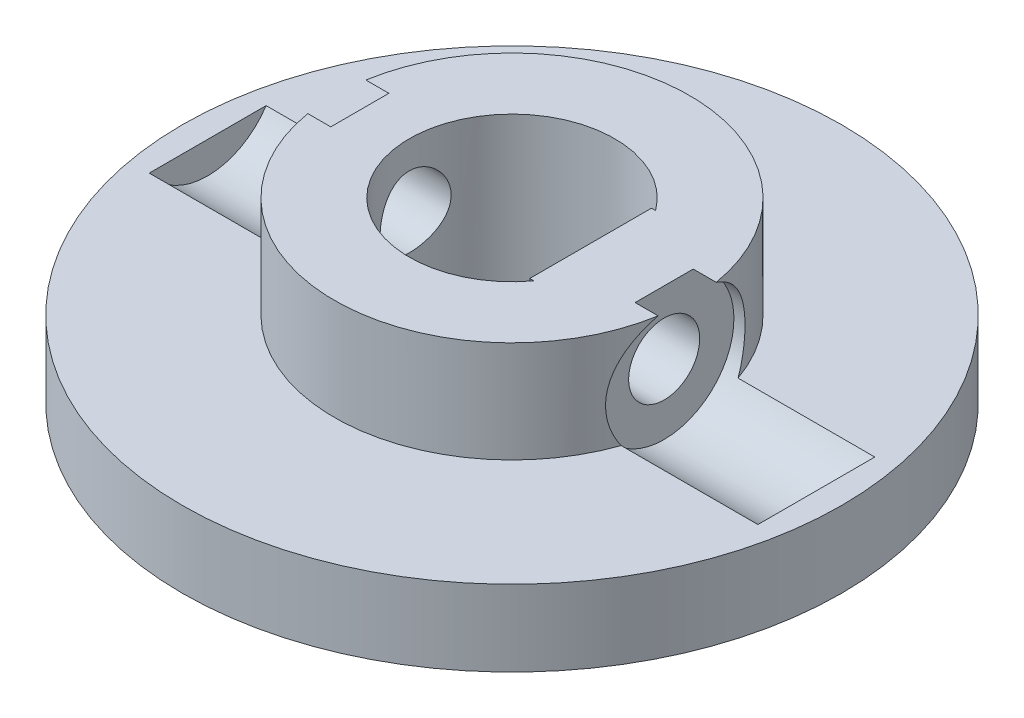
ISO-10303-21;
HEADER;
FILE_DESCRIPTION(('STEP AP214'),'2;1');
FILE_NAME('part.step','',(''),(''),'','','');
FILE_SCHEMA(('AUTOMOTIVE_DESIGN { 1 0 10303 214 1 1 1 1 }'));
ENDSEC;
DATA;
#1=APPLICATION_CONTEXT('core data for automotive mechanical design processes');
#2=APPLICATION_PROTOCOL_DEFINITION('international standard','automotive_design',2000,#1);
#3=PRODUCT_CONTEXT('',#1,'mechanical');
#4=PRODUCT('Part','Part','',(#3));
#5=PRODUCT_RELATED_PRODUCT_CATEGORY('part','',(#4));
#6=PRODUCT_DEFINITION_FORMATION('','',#4);
#7=PRODUCT_DEFINITION_CONTEXT('part definition',#1,'design');
#8=PRODUCT_DEFINITION('design','',#6,#7);
#9=PRODUCT_DEFINITION_SHAPE('','',#8);
#10=(LENGTH_UNIT() NAMED_UNIT(*) SI_UNIT(.MILLI.,.METRE.));
#11=(NAMED_UNIT(*) PLANE_ANGLE_UNIT() SI_UNIT($,.RADIAN.));
#12=(NAMED_UNIT(*) SI_UNIT($,.STERADIAN.) SOLID_ANGLE_UNIT());
#13=UNCERTAINTY_MEASURE_WITH_UNIT(LENGTH_MEASURE(1.E-05),#10,'distance_accuracy_value','');
#14=(GEOMETRIC_REPRESENTATION_CONTEXT(3) GLOBAL_UNCERTAINTY_ASSIGNED_CONTEXT((#13)) GLOBAL_UNIT_ASSIGNED_CONTEXT((#10,
#11,#12)) REPRESENTATION_CONTEXT('',''));
#15=CARTESIAN_POINT('',(0.,0.,0.));
#16=DIRECTION('',(0.,0.,1.));
#17=DIRECTION('',(1.,0.,0.));
#18=AXIS2_PLACEMENT_3D('',#15,#16,#17);
#19=CARTESIAN_POINT('',(0.,44.,0.));
#20=DIRECTION('',(0.,-1.,0.));
#21=DIRECTION('',(0.,0.,-1.));
#22=AXIS2_PLACEMENT_3D('',#19,#20,#21);
#23=CYLINDRICAL_SURFACE('',#22,4.05);
#24=CARTESIAN_POINT('',(0.,41.,0.));
#25=DIRECTION('',(0.,1.,0.));
#26=DIRECTION('',(0.,0.,1.));
#27=AXIS2_PLACEMENT_3D('',#24,#25,#26);
#28=CIRCLE('',#27,4.05);
#29=CARTESIAN_POINT('',(0.,41.,4.05));
#30=VERTEX_POINT('',#29);
#31=EDGE_CURVE('E178',#30,#30,#28,.T.);
#32=ORIENTED_EDGE('',*,*,#31,.F.);
#33=EDGE_LOOP('',(#32));
#34=FACE_BOUND('',#33,.T.);
#35=CARTESIAN_POINT('',(0.,48.,0.));
#36=DIRECTION('',(0.,1.,0.));
#37=DIRECTION('',(0.,0.,1.));
#38=AXIS2_PLACEMENT_3D('',#35,#36,#37);
#39=CIRCLE('',#38,4.05);
#40=CARTESIAN_POINT('',(3.26228447563973,48.,-2.4));
#41=VERTEX_POINT('',#40);
#42=CARTESIAN_POINT('',(3.26228447563973,48.,2.4));
#43=VERTEX_POINT('',#42);
#44=EDGE_CURVE('E193',#41,#43,#39,.T.);
#45=ORIENTED_EDGE('',*,*,#44,.T.);
#46=DIRECTION('',(0.,-1.,0.));
#47=VECTOR('',#46,1.);
#48=CARTESIAN_POINT('',(3.26228447563973,44.,2.4));
#49=LINE('',#48,#47);
#50=CARTESIAN_POINT('',(3.26228447563973,44.,2.4));
#51=VERTEX_POINT('',#50);
#52=EDGE_CURVE('E196',#43,#51,#49,.T.);
#53=ORIENTED_EDGE('',*,*,#52,.T.);
#54=CARTESIAN_POINT('',(0.,44.,0.));
#55=DIRECTION('',(0.,-1.,0.));
#56=DIRECTION('',(0.,0.,-1.));
#57=AXIS2_PLACEMENT_3D('',#54,#55,#56);
#58=CIRCLE('',#57,4.05);
#59=CARTESIAN_POINT('',(3.26228447563973,44.,-2.4));
#60=VERTEX_POINT('',#59);
#61=EDGE_CURVE('E166',#60,#51,#58,.T.);
#62=ORIENTED_EDGE('',*,*,#61,.F.);
#63=DIRECTION('',(0.,-1.,0.));
#64=VECTOR('',#63,1.);
#65=CARTESIAN_POINT('',(3.26228447563973,44.,-2.4));
#66=LINE('',#65,#64);
#67=EDGE_CURVE('E197',#60,#41,#66,.F.);
#68=ORIENTED_EDGE('',*,*,#67,.T.);
#69=EDGE_LOOP('',(#45,#53,#62,#68));
#70=FACE_BOUND('',#69,.T.);
#71=CARTESIAN_POINT('',(-3.80032893313197,45.5,1.4));
#72=CARTESIAN_POINT('',(-3.80032812113727,45.5760720109124,1.40000098422699));
#73=CARTESIAN_POINT('',(-3.80263798720384,45.6521371854911,1.39377881376786));
#74=CARTESIAN_POINT('',(-3.81157522511216,45.8020024885736,1.36914665694002));
#75=CARTESIAN_POINT('',(-3.81820304552078,45.8758023809165,1.35073540431613));
#76=CARTESIAN_POINT('',(-3.83493767525478,46.018939410854,1.30245835758085));
#77=CARTESIAN_POINT('',(-3.84503724069611,46.0882854866961,1.27261639922499));
#78=CARTESIAN_POINT('',(-3.86756654231983,46.2210109336976,1.20240741585234));
#79=CARTESIAN_POINT('',(-3.87999685084287,46.2843888335485,1.16203780469628));
#80=CARTESIAN_POINT('',(-3.90637404148735,46.4060480971093,1.07009820004064));
#81=CARTESIAN_POINT('',(-3.92036074894465,46.4640417447618,1.01815881625623));
#82=CARTESIAN_POINT('',(-3.94793946307876,46.5706936749783,0.905341059514607));
#83=CARTESIAN_POINT('',(-3.96153140048799,46.619350327542,0.844461129035619));
#84=CARTESIAN_POINT('',(-3.98725371248317,46.7072752086933,0.713363730382172));
#85=CARTESIAN_POINT('',(-3.99933183709569,46.7462387648325,0.642930762475667));
#86=CARTESIAN_POINT('',(-4.02019373787452,46.8116491222764,0.496020316335563));
#87=CARTESIAN_POINT('',(-4.02897847330284,46.8380995688502,0.419544606035188));
#88=CARTESIAN_POINT('',(-4.0419815428216,46.8767477547424,0.265738581644376));
#89=CARTESIAN_POINT('',(-4.04635758356729,46.8894390702158,0.188545877578348));
#90=CARTESIAN_POINT('',(-4.05061176756717,46.9017815716772,0.0330107300172756));
#91=CARTESIAN_POINT('',(-4.05049115574787,46.9014363669073,-0.0453313892508603));
#92=CARTESIAN_POINT('',(-4.04587064154934,46.888021421929,-0.197435441900466));
#93=CARTESIAN_POINT('',(-4.04155549413247,46.8754884993241,-0.27125126713992));
#94=CARTESIAN_POINT('',(-4.0292656767644,46.8389459485529,-0.415658936889611));
#95=CARTESIAN_POINT('',(-4.0212907544945,46.8149355290797,-0.486250558742079));
#96=CARTESIAN_POINT('',(-4.00234991178046,46.7558249823521,-0.623340113362765));
#97=CARTESIAN_POINT('',(-3.99134472604314,46.7205782399222,-0.6897691792348));
#98=CARTESIAN_POINT('',(-3.96747993983604,46.6401187038445,-0.815923333139488));
#99=CARTESIAN_POINT('',(-3.95461979781574,46.5949029977346,-0.875646454298757));
#100=CARTESIAN_POINT('',(-3.92762744149222,46.4931168725459,-0.98987949259288));
#101=CARTESIAN_POINT('',(-3.91346378134078,46.4360890940775,-1.04397506209571));
#102=CARTESIAN_POINT('',(-3.88599906105279,46.313659638694,-1.14197538851592));
#103=CARTESIAN_POINT('',(-3.87269815587486,46.2482564637213,-1.18587831837483));
#104=CARTESIAN_POINT('',(-3.84828505094871,46.1095294501499,-1.26288033946573));
#105=CARTESIAN_POINT('',(-3.83721218685493,46.0360936041449,-1.29579107646938));
#106=CARTESIAN_POINT('',(-3.81896289837998,45.8842416205629,-1.34863382894297));
#107=CARTESIAN_POINT('',(-3.81178469219259,45.8058277787914,-1.36857178029633));
#108=CARTESIAN_POINT('',(-3.80254545820197,45.6502843860542,-1.39403146355698));
#109=CARTESIAN_POINT('',(-3.80025495155443,45.573274409251,-1.40020034618308));
#110=CARTESIAN_POINT('',(-3.80040653990353,45.4193020253982,-1.39978981303751));
#111=CARTESIAN_POINT('',(-3.80284768993273,45.3423396119202,-1.3932129427425));
#112=CARTESIAN_POINT('',(-3.81195747997688,45.193693673689,-1.36808078294112));
#113=CARTESIAN_POINT('',(-3.81846234457071,45.1219206345597,-1.34998905566805));
#114=CARTESIAN_POINT('',(-3.83478240945058,44.9824481574394,-1.30290459847902));
#115=CARTESIAN_POINT('',(-3.84459822383498,44.9147494778871,-1.27390984620999));
#116=CARTESIAN_POINT('',(-3.86684046898231,44.7828328835213,-1.20474187839379));
#117=CARTESIAN_POINT('',(-3.87934330860911,44.7188074219997,-1.16422687022564));
#118=CARTESIAN_POINT('',(-3.90540844751767,44.5982309299537,-1.07354883196725));
#119=CARTESIAN_POINT('',(-3.91897108066806,44.541682270086,-1.02338275414744));
#120=CARTESIAN_POINT('',(-3.94648649728668,44.4346007802007,-0.911710279289806));
#121=CARTESIAN_POINT('',(-3.96042252246501,44.3845380135079,-0.84974761531962));
#122=CARTESIAN_POINT('',(-3.98641977085735,44.2954830136483,-0.717956937741279));
#123=CARTESIAN_POINT('',(-3.99848104430982,44.256490483805,-0.648129134984759));
#124=CARTESIAN_POINT('',(-4.019324464162,44.1910195232052,-0.502868298688732));
#125=CARTESIAN_POINT('',(-4.02812570094353,44.1644679887241,-0.427471101847702));
#126=CARTESIAN_POINT('',(-4.04153726330383,44.1245431969524,-0.272914258615079));
#127=CARTESIAN_POINT('',(-4.04614922934161,44.1111647810829,-0.193756097752663));
#128=CARTESIAN_POINT('',(-4.0505296031405,44.0984573883936,-0.0382083464369651));
#129=CARTESIAN_POINT('',(-4.05052988190709,44.0984558381744,0.0381203340772005));
#130=CARTESIAN_POINT('',(-4.04626733993027,44.1108228838361,0.189639953947756));
#131=CARTESIAN_POINT('',(-4.04200491005722,44.1231903455367,0.264830996978448));
#132=CARTESIAN_POINT('',(-4.02978738559328,44.1594890816326,0.410573093003151));
#133=CARTESIAN_POINT('',(-4.02190072905705,44.1832063610843,0.481183598177917));
#134=CARTESIAN_POINT('',(-4.00324819123401,44.2413295659086,0.617445005907795));
#135=CARTESIAN_POINT('',(-3.99248177784391,44.2757374668169,0.683094989010976));
#136=CARTESIAN_POINT('',(-3.96865262150081,44.3557898576263,0.810339080391839));
#137=CARTESIAN_POINT('',(-3.95551726283513,44.4018169242524,0.871678698228788));
#138=CARTESIAN_POINT('',(-3.928587176257,44.5031645067486,0.985980365684454));
#139=CARTESIAN_POINT('',(-3.91479223118132,44.5584880987065,1.03893963106469));
#140=CARTESIAN_POINT('',(-3.88738614533976,44.6796966341466,1.13729968324724));
#141=CARTESIAN_POINT('',(-3.87380837984383,44.7459332733859,1.18227784474417));
#142=CARTESIAN_POINT('',(-3.84908641549547,44.8854528212596,1.2604452216498));
#143=CARTESIAN_POINT('',(-3.83794181460534,44.9587345629279,1.29363638522155));
#144=CARTESIAN_POINT('',(-3.81969760982419,45.1088255159717,1.34654514346996));
#145=CARTESIAN_POINT('',(-3.81252115077366,45.1855341227965,1.36652032703137));
#146=CARTESIAN_POINT('',(-3.80283821522738,45.3414983480825,1.39324446748198));
#147=CARTESIAN_POINT('',(-3.80032977901784,45.4207528834988,1.39999897469319));
#148=CARTESIAN_POINT('',(-3.80032893313197,45.5,1.4));
#149=B_SPLINE_CURVE_WITH_KNOTS('',3,(#71,#72,#73,#74,#75,#76,#77,#78,#79,#80,#81,#82,#83,#84,
#85,#86,#87,#88,#89,#90,#91,#92,#93,#94,#95,#96,#97,#98,#99,#100,#101,#102,#103,#104,#105,#106,
#107,#108,#109,#110,#111,#112,#113,#114,#115,#116,#117,#118,#119,#120,#121,#122,#123,#124,#125,
#126,#127,#128,#129,#130,#131,#132,#133,#134,#135,#136,#137,#138,#139,#140,#141,#142,#143,#144,
#145,#146,#147,#148),.UNSPECIFIED.,.T.,.F.,(4,2,2,2,2,2,2,2,2,2,2,2,2,2,2,2,2,2,2,2,2,2,2,2,2,2,
2,2,2,2,2,2,2,2,2,2,2,2,4),(0.,0.227922099188714,0.455867879638449,0.683340903684274,
0.910869859663723,1.14710288999006,1.38337712311254,1.62633813931509,1.86922833343483,
2.1030834348325,2.33687379245654,2.56081235872791,2.78476636648917,3.01177121572749,
3.23884247319105,3.47735601694402,3.71591228194712,3.95836845901259,4.20071361862837,
4.43140470605175,4.66204972650137,4.88395084092895,5.10589313511526,5.33526697493179,
5.56471336840146,5.80617438972034,6.04762893940022,6.28764632819606,6.52756968901762,
6.75542990555556,6.98326923029712,7.2069725577209,7.43071724822078,7.66310137283703,
7.89556254200708,8.13801357321436,8.38042451327956,8.61795940461311,8.8553945523235),.UNSPECIFIED.);
#150=CARTESIAN_POINT('',(-3.80032893313197,45.5,1.4));
#151=VERTEX_POINT('',#150);
#152=EDGE_CURVE('E330',#151,#151,#149,.T.);
#153=ORIENTED_EDGE('',*,*,#152,.T.);
#154=EDGE_LOOP('',(#153));
#155=FACE_BOUND('',#154,.T.);
#156=ADVANCED_FACE('F42',(#34,#70,#155),#23,.F.);
#157=CARTESIAN_POINT('',(0.,48.,0.));
#158=DIRECTION('',(0.,-1.,0.));
#159=DIRECTION('',(0.,0.,-1.));
#160=AXIS2_PLACEMENT_3D('',#157,#158,#159);
#161=CYLINDRICAL_SURFACE('',#160,7.);
#162=CARTESIAN_POINT('',(6.90561365846661,48.0000000000001,1.14564392373868));
#163=CARTESIAN_POINT('',(6.89374771517784,47.9672099399644,1.21719398865301));
#164=CARTESIAN_POINT('',(6.8809909750092,47.9314261332552,1.28717055550123));
#165=CARTESIAN_POINT('',(6.85406593743405,47.8541551666594,1.42358793963985));
#166=CARTESIAN_POINT('',(6.83989807481792,47.8126697620428,1.49002983640068));
#167=CARTESIAN_POINT('',(6.79585965600312,47.6801715267832,1.68336390921621));
#168=CARTESIAN_POINT('',(6.76442078484839,47.5810280607942,1.80445655817006));
#169=CARTESIAN_POINT('',(6.700825905405,47.3639520973799,2.02792279637564));
#170=CARTESIAN_POINT('',(6.66867031370821,47.2460302818912,2.13030695714263));
#171=CARTESIAN_POINT('',(6.60717780123408,46.9940535394791,2.3139991563166));
#172=CARTESIAN_POINT('',(6.57784103462369,46.8599977310589,2.3953060423795));
#173=CARTESIAN_POINT('',(6.52541302668286,46.5782940984035,2.53467706584074));
#174=CARTESIAN_POINT('',(6.50235228152522,46.4305844196177,2.59262834725676));
#175=CARTESIAN_POINT('',(6.4658390536539,46.1263313237695,2.68240847070945));
#176=CARTESIAN_POINT('',(6.4523794062531,45.9697945881061,2.71425679436916));
#177=CARTESIAN_POINT('',(6.4376000666213,45.6639940638352,2.74911503811838));
#178=CARTESIAN_POINT('',(6.43550473897019,45.5149765908663,2.75396807491659));
#179=CARTESIAN_POINT('',(6.4416514631516,45.2182803690281,2.73955976665491));
#180=CARTESIAN_POINT('',(6.44989626655289,45.0706019870333,2.72029200291272));
#181=CARTESIAN_POINT('',(6.47511345186074,44.7866375181246,2.65968269546306));
#182=CARTESIAN_POINT('',(6.49174108955373,44.6501317524967,2.61921077429098));
#183=CARTESIAN_POINT('',(6.53157679921105,44.3859922643528,2.51821963627434));
#184=CARTESIAN_POINT('',(6.55477515037485,44.2583457800468,2.45773001179301));
#185=CARTESIAN_POINT('',(6.58962711681446,44.0901150157458,2.36169288332092));
#186=CARTESIAN_POINT('',(6.59952539332644,44.0446014024288,2.33392076808522));
#187=CARTESIAN_POINT('',(6.60965203320115,44.,2.30488611432322));
#188=B_SPLINE_CURVE_WITH_KNOTS('',3,(#162,#163,#164,#165,#166,#167,#168,#169,#170,#171,#172,
#173,#174,#175,#176,#177,#178,#179,#180,#181,#182,#183,#184,#185,#186,#187),.UNSPECIFIED.,.F.,
.F.,(4,2,2,2,2,2,2,2,2,2,2,2,4),(0.,0.238619065829173,0.477164835260656,0.953622215237771,
1.42980952751207,1.90602286857606,2.3845104854077,2.86264066283429,3.30768404922417,
3.75284588937002,4.18103491938148,4.608593760241,4.77117468194661),.UNSPECIFIED.);
#189=CARTESIAN_POINT('',(6.90561365846657,48.,1.14564392373895));
#190=VERTEX_POINT('',#189);
#191=CARTESIAN_POINT('',(6.60965203320115,44.,2.30488611432322));
#192=VERTEX_POINT('',#191);
#193=EDGE_CURVE('E139',#190,#192,#188,.T.);
#194=ORIENTED_EDGE('',*,*,#193,.F.);
#195=CARTESIAN_POINT('',(0.,48.,0.));
#196=DIRECTION('',(0.,1.,0.));
#197=DIRECTION('',(0.,0.,1.));
#198=AXIS2_PLACEMENT_3D('',#195,#196,#197);
#199=CIRCLE('',#198,7.);
#200=CARTESIAN_POINT('',(-6.90561365846657,48.,1.14564392373895));
#201=VERTEX_POINT('',#200);
#202=EDGE_CURVE('E152',#201,#190,#199,.T.);
#203=ORIENTED_EDGE('',*,*,#202,.F.);
#204=CARTESIAN_POINT('',(-6.60965203320114,44.,2.30488611432322));
#205=CARTESIAN_POINT('',(-6.59568501825157,44.0615453861743,2.34493522330866));
#206=CARTESIAN_POINT('',(-6.58216021518056,44.124738940473,2.38255374900942));
#207=CARTESIAN_POINT('',(-6.55634079144323,44.2541527637522,2.45271163251482));
#208=CARTESIAN_POINT('',(-6.54404659474213,44.3203740644756,2.48524924200315));
#209=CARTESIAN_POINT('',(-6.50952833040666,44.5231959508692,2.57491275879076));
#210=CARTESIAN_POINT('',(-6.48968733634494,44.6638751205404,2.62403757518697));
#211=CARTESIAN_POINT('',(-6.45883287389979,44.9525874953405,2.6991028997718));
#212=CARTESIAN_POINT('',(-6.4478420241898,45.1006385232308,2.72498402243279));
#213=CARTESIAN_POINT('',(-6.43626229357804,45.3992172752677,2.75222839699502));
#214=CARTESIAN_POINT('',(-6.43565865775367,45.5497411822187,2.75362642690917));
#215=CARTESIAN_POINT('',(-6.44469580155875,45.8421383656096,2.73239865151887));
#216=CARTESIAN_POINT('',(-6.4538923966254,45.9841032486188,2.71081452167777));
#217=CARTESIAN_POINT('',(-6.48068942615988,46.2622542164856,2.64610558995576));
#218=CARTESIAN_POINT('',(-6.49829457973526,46.3984370094888,2.6029686914581));
#219=CARTESIAN_POINT('',(-6.54023864066011,46.6639292749634,2.49572248857795));
#220=CARTESIAN_POINT('',(-6.56468895119549,46.7930787434429,2.43126270493192));
#221=CARTESIAN_POINT('',(-6.61756599887328,47.0392075409629,2.28341166546903));
#222=CARTESIAN_POINT('',(-6.64599520045969,47.1561792484418,2.20000865651066));
#223=CARTESIAN_POINT('',(-6.7062208183766,47.3838402786919,2.00931187642541));
#224=CARTESIAN_POINT('',(-6.73810965750939,47.4933950699999,1.90069287445062));
#225=CARTESIAN_POINT('',(-6.79982015224112,47.6929569760376,1.66644277759549));
#226=CARTESIAN_POINT('',(-6.8296451893516,47.78299660841,1.5408405575959));
#227=CARTESIAN_POINT('',(-6.86558285366093,47.8873178823732,1.36589425449308));
#228=CARTESIAN_POINT('',(-6.87403605944346,47.9115006864453,1.32273248274466));
#229=CARTESIAN_POINT('',(-6.89031326346975,47.9575148487932,1.2351353281723));
#230=CARTESIAN_POINT('',(-6.89813810323687,47.9793493657217,1.19070176058713));
#231=CARTESIAN_POINT('',(-6.90561365846657,48.0000000000001,1.14564392373903));
#232=B_SPLINE_CURVE_WITH_KNOTS('',3,(#204,#205,#206,#207,#208,#209,#210,#211,#212,#213,#214,
#215,#216,#217,#218,#219,#220,#221,#222,#223,#224,#225,#226,#227,#228,#229,#230,#231),
.UNSPECIFIED.,.F.,.F.,(4,2,2,2,2,2,2,2,2,2,2,2,2,4),(0.,0.224116175974806,0.448309300009073,
0.896981977352828,1.34679773821932,1.7959744879356,2.22562550327724,2.65551793409134,
3.09286001948791,3.5304741943996,4.0010082529955,4.47075213935283,4.62127209392152,
4.77158698475304),.UNSPECIFIED.);
#233=CARTESIAN_POINT('',(-6.60965203320114,44.,2.30488611432322));
#234=VERTEX_POINT('',#233);
#235=EDGE_CURVE('E262',#234,#201,#232,.T.);
#236=ORIENTED_EDGE('',*,*,#235,.F.);
#237=CARTESIAN_POINT('',(0.,44.,0.));
#238=DIRECTION('',(0.,1.,0.));
#239=DIRECTION('',(0.,0.,1.));
#240=AXIS2_PLACEMENT_3D('',#237,#238,#239);
#241=CIRCLE('',#240,7.);
#242=EDGE_CURVE('E175',#234,#192,#241,.T.);
#243=ORIENTED_EDGE('',*,*,#242,.T.);
#244=EDGE_LOOP('',(#194,#203,#236,#243));
#245=FACE_BOUND('',#244,.T.);
#246=ADVANCED_FACE('F250',(#245),#161,.T.);
#247=CARTESIAN_POINT('',(6.60965203320115,44.,-2.30488611432322));
#248=CARTESIAN_POINT('',(6.59568501825157,44.0615453861742,-2.34493522330866));
#249=CARTESIAN_POINT('',(6.58216021518056,44.124738940473,-2.38255374900941));
#250=CARTESIAN_POINT('',(6.55634079144323,44.2541527637522,-2.45271163251482));
#251=CARTESIAN_POINT('',(6.54404659474213,44.3203740644756,-2.48524924200314));
#252=CARTESIAN_POINT('',(6.50952833040667,44.5231959508692,-2.57491275879075));
#253=CARTESIAN_POINT('',(6.48968733634494,44.6638751205404,-2.62403757518697));
#254=CARTESIAN_POINT('',(6.45883287389979,44.9525874953405,-2.6991028997718));
#255=CARTESIAN_POINT('',(6.4478420241898,45.1006385232308,-2.72498402243279));
#256=CARTESIAN_POINT('',(6.43626229357804,45.3992172752677,-2.75222839699501));
#257=CARTESIAN_POINT('',(6.43565865775367,45.5497411822187,-2.75362642690917));
#258=CARTESIAN_POINT('',(6.44469580155875,45.8421383656096,-2.73239865151887));
#259=CARTESIAN_POINT('',(6.45389239662541,45.9841032486188,-2.71081452167777));
#260=CARTESIAN_POINT('',(6.48068942615988,46.2622542164856,-2.64610558995576));
#261=CARTESIAN_POINT('',(6.49829457973526,46.3984370094888,-2.6029686914581));
#262=CARTESIAN_POINT('',(6.54023864066011,46.6639292749634,-2.49572248857795));
#263=CARTESIAN_POINT('',(6.56468895119549,46.7930787434429,-2.43126270493192));
#264=CARTESIAN_POINT('',(6.61756599887328,47.0392075409629,-2.28341166546903));
#265=CARTESIAN_POINT('',(6.64599520045969,47.1561792484418,-2.20000865651067));
#266=CARTESIAN_POINT('',(6.7062208183766,47.3838402786919,-2.00931187642541));
#267=CARTESIAN_POINT('',(6.73810965750939,47.4933950699999,-1.90069287445062));
#268=CARTESIAN_POINT('',(6.79982015224112,47.6929569760376,-1.66644277759549));
#269=CARTESIAN_POINT('',(6.8296451893516,47.78299660841,-1.5408405575959));
#270=CARTESIAN_POINT('',(6.86558285366094,47.8873178823733,-1.36589425449304));
#271=CARTESIAN_POINT('',(6.87403605944347,47.9115006864454,-1.32273248274457));
#272=CARTESIAN_POINT('',(6.89031326346978,47.9575148487933,-1.23513532817212));
#273=CARTESIAN_POINT('',(6.89813810323691,47.9793493657218,-1.19070176058691));
#274=CARTESIAN_POINT('',(6.90561365846662,48.0000000000002,-1.14564392373876));
#275=B_SPLINE_CURVE_WITH_KNOTS('',3,(#247,#248,#249,#250,#251,#252,#253,#254,#255,#256,#257,
#258,#259,#260,#261,#262,#263,#264,#265,#266,#267,#268,#269,#270,#271,#272,#273,#274),
.UNSPECIFIED.,.F.,.F.,(4,2,2,2,2,2,2,2,2,2,2,2,2,4),(0.,0.224116175974814,0.448309300009079,
0.896981977352829,1.34679773821932,1.79597448793561,2.22562550327725,2.65551793409134,
3.09286001948791,3.5304741943996,4.00100825299551,4.47075213935283,4.62127209392168,
4.77158698475335),.UNSPECIFIED.);
#276=CARTESIAN_POINT('',(6.60965203320115,44.,-2.30488611432322));
#277=VERTEX_POINT('',#276);
#278=CARTESIAN_POINT('',(6.90561365846657,48.,-1.14564392373895));
#279=VERTEX_POINT('',#278);
#280=EDGE_CURVE('E283',#277,#279,#275,.T.);
#281=ORIENTED_EDGE('',*,*,#280,.F.);
#282=CARTESIAN_POINT('',(-6.60965203320114,44.,-2.30488611432322));
#283=VERTEX_POINT('',#282);
#284=EDGE_CURVE('E181',#277,#283,#241,.T.);
#285=ORIENTED_EDGE('',*,*,#284,.T.);
#286=CARTESIAN_POINT('',(-6.90561365846657,48.,-1.14564392373895));
#287=CARTESIAN_POINT('',(-6.89374771517779,47.9672099399643,-1.21719398865328));
#288=CARTESIAN_POINT('',(-6.88099097500915,47.9314261332551,-1.2871705555015));
#289=CARTESIAN_POINT('',(-6.854065937434,47.8541551666593,-1.42358793964011));
#290=CARTESIAN_POINT('',(-6.83989807481786,47.8126697620427,-1.49002983640094));
#291=CARTESIAN_POINT('',(-6.79585965600306,47.680171526783,-1.68336390921646));
#292=CARTESIAN_POINT('',(-6.76442078484833,47.5810280607939,-1.8044565581703));
#293=CARTESIAN_POINT('',(-6.70082590540493,47.3639520973796,-2.02792279637585));
#294=CARTESIAN_POINT('',(-6.66867031370815,47.246030281891,-2.13030695714283));
#295=CARTESIAN_POINT('',(-6.60717780123402,46.9940535394789,-2.31399915631677));
#296=CARTESIAN_POINT('',(-6.57784103462363,46.8599977310586,-2.39530604237966));
#297=CARTESIAN_POINT('',(-6.52541302668281,46.5782940984032,-2.53467706584087));
#298=CARTESIAN_POINT('',(-6.50235228152518,46.4305844196174,-2.59262834725687));
#299=CARTESIAN_POINT('',(-6.46583905365387,46.1263313237692,-2.68240847070952));
#300=CARTESIAN_POINT('',(-6.45237940625307,45.9697945881058,-2.71425679436922));
#301=CARTESIAN_POINT('',(-6.43760006662129,45.6639940638349,-2.7491150381184));
#302=CARTESIAN_POINT('',(-6.43550473897019,45.514976590866,-2.7539680749166));
#303=CARTESIAN_POINT('',(-6.44165146315161,45.2182803690278,-2.73955976665488));
#304=CARTESIAN_POINT('',(-6.44989626655291,45.070601987033,-2.72029200291267));
#305=CARTESIAN_POINT('',(-6.47511345186077,44.7866375181243,-2.65968269546299));
#306=CARTESIAN_POINT('',(-6.49174108955376,44.6501317524964,-2.61921077429089));
#307=CARTESIAN_POINT('',(-6.5315767992111,44.3859922643525,-2.51821963627422));
#308=CARTESIAN_POINT('',(-6.5547751503749,44.2583457800465,-2.45773001179288));
#309=CARTESIAN_POINT('',(-6.58962711681449,44.0901150157456,-2.36169288332082));
#310=CARTESIAN_POINT('',(-6.59952539332645,44.0446014024287,-2.33392076808517));
#311=CARTESIAN_POINT('',(-6.60965203320115,44.,-2.30488611432323));
#312=B_SPLINE_CURVE_WITH_KNOTS('',3,(#286,#287,#288,#289,#290,#291,#292,#293,#294,#295,#296,
#297,#298,#299,#300,#301,#302,#303,#304,#305,#306,#307,#308,#309,#310,#311),.UNSPECIFIED.,.F.,
.F.,(4,2,2,2,2,2,2,2,2,2,2,2,4),(0.,0.238619065829178,0.477164835260662,0.953622215237782,
1.4298095275121,1.90602286857609,2.38451048540773,2.8626406628343,3.30768404922417,
3.75284588937001,4.18103491938147,4.60859376024099,4.7711746819463),.UNSPECIFIED.);
#313=CARTESIAN_POINT('',(-6.90561365846657,48.,-1.14564392373895));
#314=VERTEX_POINT('',#313);
#315=EDGE_CURVE('E237',#314,#283,#312,.T.);
#316=ORIENTED_EDGE('',*,*,#315,.F.);
#317=EDGE_CURVE('E195',#279,#314,#199,.T.);
#318=ORIENTED_EDGE('',*,*,#317,.F.);
#319=EDGE_LOOP('',(#281,#285,#316,#318));
#320=FACE_BOUND('',#319,.T.);
#321=ADVANCED_FACE('F390',(#320),#161,.T.);
#322=CARTESIAN_POINT('',(0.,44.,0.));
#323=DIRECTION('',(0.,1.,0.));
#324=DIRECTION('',(0.,0.,1.));
#325=AXIS2_PLACEMENT_3D('',#322,#323,#324);
#326=PLANE('',#325);
#327=CARTESIAN_POINT('',(0.,44.,0.));
#328=DIRECTION('',(0.,1.,0.));
#329=DIRECTION('',(0.,0.,1.));
#330=AXIS2_PLACEMENT_3D('',#327,#328,#329);
#331=CIRCLE('',#330,13.);
#332=CARTESIAN_POINT('',(0.,44.,13.));
#333=VERTEX_POINT('',#332);
#334=EDGE_CURVE('E179',#333,#333,#331,.T.);
#335=ORIENTED_EDGE('',*,*,#334,.T.);
#336=EDGE_LOOP('',(#335));
#337=FACE_BOUND('',#336,.T.);
#338=ORIENTED_EDGE('',*,*,#284,.F.);
#339=DIRECTION('',(-1.,0.,0.));
#340=VECTOR('',#339,1.);
#341=CARTESIAN_POINT('',(12.,44.,-2.30488611432323));
#342=LINE('',#341,#340);
#343=CARTESIAN_POINT('',(12.,44.,-2.30488611432323));
#344=VERTEX_POINT('',#343);
#345=EDGE_CURVE('E278',#277,#344,#342,.F.);
#346=ORIENTED_EDGE('',*,*,#345,.T.);
#347=DIRECTION('',(0.,0.,-1.));
#348=VECTOR('',#347,1.);
#349=CARTESIAN_POINT('',(12.,44.,0.));
#350=LINE('',#349,#348);
#351=CARTESIAN_POINT('',(12.,44.,2.30488611432323));
#352=VERTEX_POINT('',#351);
#353=EDGE_CURVE('E11',#352,#344,#350,.T.);
#354=ORIENTED_EDGE('',*,*,#353,.F.);
#355=DIRECTION('',(-1.,0.,0.));
#356=VECTOR('',#355,1.);
#357=CARTESIAN_POINT('',(12.,44.,2.30488611432323));
#358=LINE('',#357,#356);
#359=EDGE_CURVE('E294',#352,#192,#358,.T.);
#360=ORIENTED_EDGE('',*,*,#359,.T.);
#361=ORIENTED_EDGE('',*,*,#242,.F.);
#362=DIRECTION('',(-1.,0.,0.));
#363=VECTOR('',#362,1.);
#364=CARTESIAN_POINT('',(-6.,44.,2.30488611432323));
#365=LINE('',#364,#363);
#366=CARTESIAN_POINT('',(-12.,44.,2.30488611432323));
#367=VERTEX_POINT('',#366);
#368=EDGE_CURVE('E249',#234,#367,#365,.T.);
#369=ORIENTED_EDGE('',*,*,#368,.T.);
#370=DIRECTION('',(0.,0.,-1.));
#371=VECTOR('',#370,1.);
#372=CARTESIAN_POINT('',(-12.,44.,0.));
#373=LINE('',#372,#371);
#374=CARTESIAN_POINT('',(-12.,44.,-2.30488611432323));
#375=VERTEX_POINT('',#374);
#376=EDGE_CURVE('E153',#367,#375,#373,.T.);
#377=ORIENTED_EDGE('',*,*,#376,.T.);
#378=DIRECTION('',(-1.,0.,0.));
#379=VECTOR('',#378,1.);
#380=CARTESIAN_POINT('',(-6.,44.,-2.30488611432323));
#381=LINE('',#380,#379);
#382=EDGE_CURVE('E225',#375,#283,#381,.F.);
#383=ORIENTED_EDGE('',*,*,#382,.T.);
#384=EDGE_LOOP('',(#338,#346,#354,#360,#361,#369,#377,#383));
#385=FACE_BOUND('',#384,.T.);
#386=ADVANCED_FACE('F434',(#337,#385),#326,.T.);
#387=CARTESIAN_POINT('',(0.,48.,0.));
#388=DIRECTION('',(0.,1.,0.));
#389=DIRECTION('',(0.,0.,1.));
#390=AXIS2_PLACEMENT_3D('',#387,#388,#389);
#391=PLANE('',#390);
#392=ORIENTED_EDGE('',*,*,#44,.F.);
#393=DIRECTION('',(-1.,0.,0.));
#394=VECTOR('',#393,1.);
#395=CARTESIAN_POINT('',(3.1,48.,-2.4));
#396=LINE('',#395,#394);
#397=CARTESIAN_POINT('',(3.1,48.,-2.4));
#398=VERTEX_POINT('',#397);
#399=EDGE_CURVE('E208',#41,#398,#396,.T.);
#400=ORIENTED_EDGE('',*,*,#399,.T.);
#401=DIRECTION('',(0.,0.,1.));
#402=VECTOR('',#401,1.);
#403=CARTESIAN_POINT('',(3.1,48.,2.4));
#404=LINE('',#403,#402);
#405=CARTESIAN_POINT('',(3.1,48.,2.4));
#406=VERTEX_POINT('',#405);
#407=EDGE_CURVE('E211',#398,#406,#404,.T.);
#408=ORIENTED_EDGE('',*,*,#407,.T.);
#409=DIRECTION('',(1.,0.,0.));
#410=VECTOR('',#409,1.);
#411=CARTESIAN_POINT('',(3.1,48.,2.4));
#412=LINE('',#411,#410);
#413=EDGE_CURVE('E226',#406,#43,#412,.T.);
#414=ORIENTED_EDGE('',*,*,#413,.T.);
#415=EDGE_LOOP('',(#392,#400,#408,#414));
#416=FACE_BOUND('',#415,.T.);
#417=DIRECTION('',(0.,0.,-1.));
#418=VECTOR('',#417,1.);
#419=CARTESIAN_POINT('',(6.,48.,0.));
#420=LINE('',#419,#418);
#421=CARTESIAN_POINT('',(6.,48.,1.14564392373895));
#422=VERTEX_POINT('',#421);
#423=CARTESIAN_POINT('',(6.,48.,-1.14564392373895));
#424=VERTEX_POINT('',#423);
#425=EDGE_CURVE('E135',#422,#424,#420,.T.);
#426=ORIENTED_EDGE('',*,*,#425,.T.);
#427=DIRECTION('',(-1.,0.,0.));
#428=VECTOR('',#427,1.);
#429=CARTESIAN_POINT('',(12.,48.,-1.14564392373895));
#430=LINE('',#429,#428);
#431=EDGE_CURVE('E53',#424,#279,#430,.F.);
#432=ORIENTED_EDGE('',*,*,#431,.T.);
#433=ORIENTED_EDGE('',*,*,#317,.T.);
#434=DIRECTION('',(-1.,0.,0.));
#435=VECTOR('',#434,1.);
#436=CARTESIAN_POINT('',(-6.,48.,-1.14564392373895));
#437=LINE('',#436,#435);
#438=CARTESIAN_POINT('',(-6.,48.,-1.14564392373895));
#439=VERTEX_POINT('',#438);
#440=EDGE_CURVE('E158',#314,#439,#437,.F.);
#441=ORIENTED_EDGE('',*,*,#440,.T.);
#442=DIRECTION('',(0.,0.,-1.));
#443=VECTOR('',#442,1.);
#444=CARTESIAN_POINT('',(-6.,48.,0.));
#445=LINE('',#444,#443);
#446=CARTESIAN_POINT('',(-6.,48.,1.14564392373895));
#447=VERTEX_POINT('',#446);
#448=EDGE_CURVE('E275',#447,#439,#445,.T.);
#449=ORIENTED_EDGE('',*,*,#448,.F.);
#450=DIRECTION('',(-1.,0.,0.));
#451=VECTOR('',#450,1.);
#452=CARTESIAN_POINT('',(-6.,48.,1.14564392373895));
#453=LINE('',#452,#451);
#454=EDGE_CURVE('E167',#447,#201,#453,.T.);
#455=ORIENTED_EDGE('',*,*,#454,.T.);
#456=ORIENTED_EDGE('',*,*,#202,.T.);
#457=DIRECTION('',(-1.,0.,0.));
#458=VECTOR('',#457,1.);
#459=CARTESIAN_POINT('',(12.,48.,1.14564392373895));
#460=LINE('',#459,#458);
#461=EDGE_CURVE('E144',#190,#422,#460,.T.);
#462=ORIENTED_EDGE('',*,*,#461,.T.);
#463=EDGE_LOOP('',(#426,#432,#433,#441,#449,#455,#456,#462));
#464=FACE_BOUND('',#463,.T.);
#465=ADVANCED_FACE('F148',(#416,#464),#391,.T.);
#466=CARTESIAN_POINT('',(0.,41.,0.));
#467=DIRECTION('',(0.,1.,0.));
#468=DIRECTION('',(0.,0.,1.));
#469=AXIS2_PLACEMENT_3D('',#466,#467,#468);
#470=PLANE('',#469);
#471=CARTESIAN_POINT('',(0.,41.,0.));
#472=DIRECTION('',(0.,1.,0.));
#473=DIRECTION('',(0.,0.,1.));
#474=AXIS2_PLACEMENT_3D('',#471,#472,#473);
#475=CIRCLE('',#474,6.);
#476=CARTESIAN_POINT('',(0.,41.,6.));
#477=VERTEX_POINT('',#476);
#478=EDGE_CURVE('E149',#477,#477,#475,.T.);
#479=ORIENTED_EDGE('',*,*,#478,.T.);
#480=EDGE_LOOP('',(#479));
#481=FACE_BOUND('',#480,.T.);
#482=CARTESIAN_POINT('',(0.,41.,0.));
#483=DIRECTION('',(0.,1.,0.));
#484=DIRECTION('',(0.,0.,1.));
#485=AXIS2_PLACEMENT_3D('',#482,#483,#484);
#486=CIRCLE('',#485,13.);
#487=CARTESIAN_POINT('',(0.,41.,13.));
#488=VERTEX_POINT('',#487);
#489=EDGE_CURVE('E173',#488,#488,#486,.T.);
#490=ORIENTED_EDGE('',*,*,#489,.F.);
#491=EDGE_LOOP('',(#490));
#492=FACE_BOUND('',#491,.T.);
#493=ADVANCED_FACE('F435',(#481,#492),#470,.F.);
#494=CARTESIAN_POINT('',(0.,44.,0.));
#495=DIRECTION('',(0.,-1.,0.));
#496=DIRECTION('',(0.,0.,-1.));
#497=AXIS2_PLACEMENT_3D('',#494,#495,#496);
#498=CYLINDRICAL_SURFACE('',#497,13.);
#499=ORIENTED_EDGE('',*,*,#334,.F.);
#500=EDGE_LOOP('',(#499));
#501=FACE_BOUND('',#500,.T.);
#502=ORIENTED_EDGE('',*,*,#489,.T.);
#503=EDGE_LOOP('',(#502));
#504=FACE_BOUND('',#503,.T.);
#505=ADVANCED_FACE('F46',(#501,#504),#498,.T.);
#506=CARTESIAN_POINT('',(0.,44.,0.));
#507=DIRECTION('',(0.,-1.,0.));
#508=DIRECTION('',(0.,0.,-1.));
#509=AXIS2_PLACEMENT_3D('',#506,#507,#508);
#510=PLANE('',#509);
#511=DIRECTION('',(-1.,0.,0.));
#512=VECTOR('',#511,1.);
#513=CARTESIAN_POINT('',(3.1,44.,-2.4));
#514=LINE('',#513,#512);
#515=CARTESIAN_POINT('',(3.1,44.,-2.4));
#516=VERTEX_POINT('',#515);
#517=EDGE_CURVE('E212',#60,#516,#514,.T.);
#518=ORIENTED_EDGE('',*,*,#517,.F.);
#519=ORIENTED_EDGE('',*,*,#61,.T.);
#520=DIRECTION('',(1.,0.,0.));
#521=VECTOR('',#520,1.);
#522=CARTESIAN_POINT('',(3.1,44.,2.4));
#523=LINE('',#522,#521);
#524=CARTESIAN_POINT('',(3.1,44.,2.4));
#525=VERTEX_POINT('',#524);
#526=EDGE_CURVE('E213',#525,#51,#523,.T.);
#527=ORIENTED_EDGE('',*,*,#526,.F.);
#528=DIRECTION('',(0.,0.,1.));
#529=VECTOR('',#528,1.);
#530=CARTESIAN_POINT('',(3.1,44.,2.4));
#531=LINE('',#530,#529);
#532=EDGE_CURVE('E216',#516,#525,#531,.T.);
#533=ORIENTED_EDGE('',*,*,#532,.F.);
#534=EDGE_LOOP('',(#518,#519,#527,#533));
#535=FACE_BOUND('',#534,.T.);
#536=ADVANCED_FACE('F265',(#535),#510,.T.);
#537=CARTESIAN_POINT('',(3.1,48.,2.4));
#538=DIRECTION('',(1.,0.,0.));
#539=DIRECTION('',(0.,0.,-1.));
#540=AXIS2_PLACEMENT_3D('',#537,#538,#539);
#541=PLANE('',#540);
#542=CARTESIAN_POINT('',(3.1,45.5,0.));
#543=DIRECTION('',(1.,0.,0.));
#544=DIRECTION('',(0.,0.,-1.));
#545=AXIS2_PLACEMENT_3D('',#542,#543,#544);
#546=CIRCLE('',#545,1.4);
#547=CARTESIAN_POINT('',(3.1,45.5,-1.4));
#548=VERTEX_POINT('',#547);
#549=EDGE_CURVE('E341',#548,#548,#546,.F.);
#550=ORIENTED_EDGE('',*,*,#549,.F.);
#551=EDGE_LOOP('',(#550));
#552=FACE_BOUND('',#551,.T.);
#553=ORIENTED_EDGE('',*,*,#532,.T.);
#554=DIRECTION('',(0.,-1.,0.));
#555=VECTOR('',#554,1.);
#556=CARTESIAN_POINT('',(3.1,48.,2.4));
#557=LINE('',#556,#555);
#558=EDGE_CURVE('E205',#406,#525,#557,.T.);
#559=ORIENTED_EDGE('',*,*,#558,.F.);
#560=ORIENTED_EDGE('',*,*,#407,.F.);
#561=DIRECTION('',(0.,-1.,0.));
#562=VECTOR('',#561,1.);
#563=CARTESIAN_POINT('',(3.1,48.,-2.4));
#564=LINE('',#563,#562);
#565=EDGE_CURVE('E207',#398,#516,#564,.T.);
#566=ORIENTED_EDGE('',*,*,#565,.T.);
#567=EDGE_LOOP('',(#553,#559,#560,#566));
#568=FACE_BOUND('',#567,.T.);
#569=ADVANCED_FACE('F413',(#552,#568),#541,.F.);
#570=CARTESIAN_POINT('',(3.1,48.,2.4));
#571=DIRECTION('',(0.,0.,-1.));
#572=DIRECTION('',(-1.,0.,0.));
#573=AXIS2_PLACEMENT_3D('',#570,#571,#572);
#574=PLANE('',#573);
#575=ORIENTED_EDGE('',*,*,#52,.F.);
#576=ORIENTED_EDGE('',*,*,#413,.F.);
#577=ORIENTED_EDGE('',*,*,#558,.T.);
#578=ORIENTED_EDGE('',*,*,#526,.T.);
#579=EDGE_LOOP('',(#575,#576,#577,#578));
#580=FACE_BOUND('',#579,.T.);
#581=ADVANCED_FACE('F411',(#580),#574,.F.);
#582=CARTESIAN_POINT('',(3.1,48.,-2.4));
#583=DIRECTION('',(0.,0.,1.));
#584=DIRECTION('',(1.,0.,0.));
#585=AXIS2_PLACEMENT_3D('',#582,#583,#584);
#586=PLANE('',#585);
#587=ORIENTED_EDGE('',*,*,#67,.F.);
#588=ORIENTED_EDGE('',*,*,#517,.T.);
#589=ORIENTED_EDGE('',*,*,#565,.F.);
#590=ORIENTED_EDGE('',*,*,#399,.F.);
#591=EDGE_LOOP('',(#587,#588,#589,#590));
#592=FACE_BOUND('',#591,.T.);
#593=ADVANCED_FACE('F256',(#592),#586,.F.);
#594=CARTESIAN_POINT('',(-6.,45.5,0.));
#595=DIRECTION('',(-1.,0.,0.));
#596=DIRECTION('',(0.,0.,1.));
#597=AXIS2_PLACEMENT_3D('',#594,#595,#596);
#598=CYLINDRICAL_SURFACE('',#597,2.75);
#599=CARTESIAN_POINT('',(-12.,45.5,0.));
#600=DIRECTION('',(1.,0.,0.));
#601=DIRECTION('',(0.,0.,-1.));
#602=AXIS2_PLACEMENT_3D('',#599,#600,#601);
#603=CIRCLE('',#602,2.75);
#604=EDGE_CURVE('E274',#367,#375,#603,.T.);
#605=ORIENTED_EDGE('',*,*,#604,.F.);
#606=ORIENTED_EDGE('',*,*,#368,.F.);
#607=ORIENTED_EDGE('',*,*,#235,.T.);
#608=ORIENTED_EDGE('',*,*,#454,.F.);
#609=CARTESIAN_POINT('',(-6.,45.5,0.));
#610=DIRECTION('',(1.,0.,0.));
#611=DIRECTION('',(0.,0.,-1.));
#612=AXIS2_PLACEMENT_3D('',#609,#610,#611);
#613=CIRCLE('',#612,2.75);
#614=EDGE_CURVE('E70',#447,#439,#613,.T.);
#615=ORIENTED_EDGE('',*,*,#614,.T.);
#616=ORIENTED_EDGE('',*,*,#440,.F.);
#617=ORIENTED_EDGE('',*,*,#315,.T.);
#618=ORIENTED_EDGE('',*,*,#382,.F.);
#619=EDGE_LOOP('',(#605,#606,#607,#608,#615,#616,#617,#618));
#620=FACE_BOUND('',#619,.T.);
#621=ADVANCED_FACE('F252',(#620),#598,.F.);
#622=CARTESIAN_POINT('',(-6.,45.5,0.));
#623=DIRECTION('',(1.,0.,0.));
#624=DIRECTION('',(0.,0.,-1.));
#625=AXIS2_PLACEMENT_3D('',#622,#623,#624);
#626=PLANE('',#625);
#627=CARTESIAN_POINT('',(-6.,45.5,0.));
#628=DIRECTION('',(1.,0.,0.));
#629=DIRECTION('',(0.,0.,-1.));
#630=AXIS2_PLACEMENT_3D('',#627,#628,#629);
#631=CIRCLE('',#630,1.4);
#632=CARTESIAN_POINT('',(-6.,45.5,-1.4));
#633=VERTEX_POINT('',#632);
#634=EDGE_CURVE('E397',#633,#633,#631,.F.);
#635=ORIENTED_EDGE('',*,*,#634,.F.);
#636=EDGE_LOOP('',(#635));
#637=FACE_BOUND('',#636,.T.);
#638=ORIENTED_EDGE('',*,*,#448,.T.);
#639=ORIENTED_EDGE('',*,*,#614,.F.);
#640=EDGE_LOOP('',(#638,#639));
#641=FACE_BOUND('',#640,.T.);
#642=ADVANCED_FACE('F257',(#637,#641),#626,.F.);
#643=CARTESIAN_POINT('',(-12.,45.5,0.));
#644=DIRECTION('',(1.,0.,0.));
#645=DIRECTION('',(0.,0.,-1.));
#646=AXIS2_PLACEMENT_3D('',#643,#644,#645);
#647=PLANE('',#646);
#648=ORIENTED_EDGE('',*,*,#604,.T.);
#649=ORIENTED_EDGE('',*,*,#376,.F.);
#650=EDGE_LOOP('',(#648,#649));
#651=FACE_BOUND('',#650,.T.);
#652=ADVANCED_FACE('F259',(#651),#647,.T.);
#653=CARTESIAN_POINT('',(12.,45.5,0.));
#654=DIRECTION('',(-1.,0.,0.));
#655=DIRECTION('',(0.,0.,1.));
#656=AXIS2_PLACEMENT_3D('',#653,#654,#655);
#657=CYLINDRICAL_SURFACE('',#656,2.75);
#658=ORIENTED_EDGE('',*,*,#280,.T.);
#659=ORIENTED_EDGE('',*,*,#431,.F.);
#660=CARTESIAN_POINT('',(6.,45.5,0.));
#661=DIRECTION('',(1.,0.,0.));
#662=DIRECTION('',(0.,0.,-1.));
#663=AXIS2_PLACEMENT_3D('',#660,#661,#662);
#664=CIRCLE('',#663,2.75);
#665=EDGE_CURVE('E58',#422,#424,#664,.T.);
#666=ORIENTED_EDGE('',*,*,#665,.F.);
#667=ORIENTED_EDGE('',*,*,#461,.F.);
#668=ORIENTED_EDGE('',*,*,#193,.T.);
#669=ORIENTED_EDGE('',*,*,#359,.F.);
#670=CARTESIAN_POINT('',(12.,45.5,0.));
#671=DIRECTION('',(1.,0.,0.));
#672=DIRECTION('',(0.,0.,-1.));
#673=AXIS2_PLACEMENT_3D('',#670,#671,#672);
#674=CIRCLE('',#673,2.75);
#675=EDGE_CURVE('E136',#352,#344,#674,.T.);
#676=ORIENTED_EDGE('',*,*,#675,.T.);
#677=ORIENTED_EDGE('',*,*,#345,.F.);
#678=EDGE_LOOP('',(#658,#659,#666,#667,#668,#669,#676,#677));
#679=FACE_BOUND('',#678,.T.);
#680=ADVANCED_FACE('F145',(#679),#657,.F.);
#681=CARTESIAN_POINT('',(12.,45.5,0.));
#682=DIRECTION('',(1.,0.,0.));
#683=DIRECTION('',(0.,0.,-1.));
#684=AXIS2_PLACEMENT_3D('',#681,#682,#683);
#685=PLANE('',#684);
#686=ORIENTED_EDGE('',*,*,#353,.T.);
#687=ORIENTED_EDGE('',*,*,#675,.F.);
#688=EDGE_LOOP('',(#686,#687));
#689=FACE_BOUND('',#688,.T.);
#690=ADVANCED_FACE('F300',(#689),#685,.F.);
#691=CARTESIAN_POINT('',(6.,45.5,0.));
#692=DIRECTION('',(1.,0.,0.));
#693=DIRECTION('',(0.,0.,-1.));
#694=AXIS2_PLACEMENT_3D('',#691,#692,#693);
#695=PLANE('',#694);
#696=CARTESIAN_POINT('',(6.,45.5,0.));
#697=DIRECTION('',(1.,0.,0.));
#698=DIRECTION('',(0.,0.,-1.));
#699=AXIS2_PLACEMENT_3D('',#696,#697,#698);
#700=CIRCLE('',#699,1.4);
#701=CARTESIAN_POINT('',(6.,45.5,-1.4));
#702=VERTEX_POINT('',#701);
#703=EDGE_CURVE('E48',#702,#702,#700,.F.);
#704=ORIENTED_EDGE('',*,*,#703,.T.);
#705=EDGE_LOOP('',(#704));
#706=FACE_BOUND('',#705,.T.);
#707=ORIENTED_EDGE('',*,*,#665,.T.);
#708=ORIENTED_EDGE('',*,*,#425,.F.);
#709=EDGE_LOOP('',(#707,#708));
#710=FACE_BOUND('',#709,.T.);
#711=ADVANCED_FACE('F134',(#706,#710),#695,.T.);
#712=CARTESIAN_POINT('',(0.,37.3,0.));
#713=DIRECTION('',(0.,1.,0.));
#714=DIRECTION('',(0.,0.,1.));
#715=AXIS2_PLACEMENT_3D('',#712,#713,#714);
#716=PLANE('',#715);
#717=CARTESIAN_POINT('',(0.,37.3,0.));
#718=DIRECTION('',(0.,1.,0.));
#719=DIRECTION('',(0.,0.,1.));
#720=AXIS2_PLACEMENT_3D('',#717,#718,#719);
#721=CIRCLE('',#720,2.425);
#722=CARTESIAN_POINT('',(0.,37.3,2.425));
#723=VERTEX_POINT('',#722);
#724=EDGE_CURVE('E319',#723,#723,#721,.T.);
#725=ORIENTED_EDGE('',*,*,#724,.T.);
#726=EDGE_LOOP('',(#725));
#727=FACE_BOUND('',#726,.T.);
#728=CARTESIAN_POINT('',(0.,37.3,0.));
#729=DIRECTION('',(0.,1.,0.));
#730=DIRECTION('',(0.,0.,1.));
#731=AXIS2_PLACEMENT_3D('',#728,#729,#730);
#732=CIRCLE('',#731,6.);
#733=CARTESIAN_POINT('',(0.,37.3,6.));
#734=VERTEX_POINT('',#733);
#735=EDGE_CURVE('E308',#734,#734,#732,.T.);
#736=ORIENTED_EDGE('',*,*,#735,.F.);
#737=EDGE_LOOP('',(#736));
#738=FACE_BOUND('',#737,.T.);
#739=ADVANCED_FACE('F369',(#727,#738),#716,.F.);
#740=CARTESIAN_POINT('',(0.,41.,0.));
#741=DIRECTION('',(0.,-1.,0.));
#742=DIRECTION('',(0.,0.,-1.));
#743=AXIS2_PLACEMENT_3D('',#740,#741,#742);
#744=CYLINDRICAL_SURFACE('',#743,6.);
#745=ORIENTED_EDGE('',*,*,#478,.F.);
#746=EDGE_LOOP('',(#745));
#747=FACE_BOUND('',#746,.T.);
#748=ORIENTED_EDGE('',*,*,#735,.T.);
#749=EDGE_LOOP('',(#748));
#750=FACE_BOUND('',#749,.T.);
#751=ADVANCED_FACE('F367',(#747,#750),#744,.T.);
#752=CARTESIAN_POINT('',(0.,41.,0.));
#753=DIRECTION('',(0.,1.,0.));
#754=DIRECTION('',(0.,0.,1.));
#755=AXIS2_PLACEMENT_3D('',#752,#753,#754);
#756=PLANE('',#755);
#757=CARTESIAN_POINT('',(0.,41.,0.));
#758=DIRECTION('',(0.,1.,0.));
#759=DIRECTION('',(0.,0.,1.));
#760=AXIS2_PLACEMENT_3D('',#757,#758,#759);
#761=CIRCLE('',#760,1.2);
#762=CARTESIAN_POINT('',(0.,41.,1.2));
#763=VERTEX_POINT('',#762);
#764=EDGE_CURVE('E321',#763,#763,#761,.T.);
#765=ORIENTED_EDGE('',*,*,#764,.F.);
#766=EDGE_LOOP('',(#765));
#767=FACE_BOUND('',#766,.T.);
#768=ORIENTED_EDGE('',*,*,#31,.T.);
#769=EDGE_LOOP('',(#768));
#770=FACE_BOUND('',#769,.T.);
#771=ADVANCED_FACE('F365',(#767,#770),#756,.T.);
#772=CARTESIAN_POINT('',(0.,39.8,0.));
#773=DIRECTION('',(0.,-1.,0.));
#774=DIRECTION('',(0.,0.,-1.));
#775=AXIS2_PLACEMENT_3D('',#772,#773,#774);
#776=CYLINDRICAL_SURFACE('',#775,2.425);
#777=CARTESIAN_POINT('',(0.,39.8,0.));
#778=DIRECTION('',(0.,1.,0.));
#779=DIRECTION('',(0.,0.,1.));
#780=AXIS2_PLACEMENT_3D('',#777,#778,#779);
#781=CIRCLE('',#780,2.425);
#782=CARTESIAN_POINT('',(0.,39.8,2.425));
#783=VERTEX_POINT('',#782);
#784=EDGE_CURVE('E311',#783,#783,#781,.T.);
#785=ORIENTED_EDGE('',*,*,#784,.T.);
#786=EDGE_LOOP('',(#785));
#787=FACE_BOUND('',#786,.T.);
#788=ORIENTED_EDGE('',*,*,#724,.F.);
#789=EDGE_LOOP('',(#788));
#790=FACE_BOUND('',#789,.T.);
#791=ADVANCED_FACE('F359',(#787,#790),#776,.F.);
#792=CARTESIAN_POINT('',(0.,39.8,0.));
#793=DIRECTION('',(0.,1.,0.));
#794=DIRECTION('',(0.,0.,1.));
#795=AXIS2_PLACEMENT_3D('',#792,#793,#794);
#796=PLANE('',#795);
#797=CARTESIAN_POINT('',(0.,39.8,0.));
#798=DIRECTION('',(0.,1.,0.));
#799=DIRECTION('',(0.,0.,1.));
#800=AXIS2_PLACEMENT_3D('',#797,#798,#799);
#801=CIRCLE('',#800,1.2);
#802=CARTESIAN_POINT('',(0.,39.8,1.2));
#803=VERTEX_POINT('',#802);
#804=EDGE_CURVE('E326',#803,#803,#801,.T.);
#805=ORIENTED_EDGE('',*,*,#804,.T.);
#806=EDGE_LOOP('',(#805));
#807=FACE_BOUND('',#806,.T.);
#808=ORIENTED_EDGE('',*,*,#784,.F.);
#809=EDGE_LOOP('',(#808));
#810=FACE_BOUND('',#809,.T.);
#811=ADVANCED_FACE('F353',(#807,#810),#796,.F.);
#812=CARTESIAN_POINT('',(0.,41.,0.));
#813=DIRECTION('',(0.,-1.,0.));
#814=DIRECTION('',(0.,0.,-1.));
#815=AXIS2_PLACEMENT_3D('',#812,#813,#814);
#816=CYLINDRICAL_SURFACE('',#815,1.2);
#817=ORIENTED_EDGE('',*,*,#764,.T.);
#818=EDGE_LOOP('',(#817));
#819=FACE_BOUND('',#818,.T.);
#820=ORIENTED_EDGE('',*,*,#804,.F.);
#821=EDGE_LOOP('',(#820));
#822=FACE_BOUND('',#821,.T.);
#823=ADVANCED_FACE('F349',(#819,#822),#816,.F.);
#824=CARTESIAN_POINT('',(13.,45.5,0.));
#825=DIRECTION('',(-1.,0.,0.));
#826=DIRECTION('',(0.,0.,1.));
#827=AXIS2_PLACEMENT_3D('',#824,#825,#826);
#828=CYLINDRICAL_SURFACE('',#827,1.4);
#829=ORIENTED_EDGE('',*,*,#703,.F.);
#830=EDGE_LOOP('',(#829));
#831=FACE_BOUND('',#830,.T.);
#832=ORIENTED_EDGE('',*,*,#549,.T.);
#833=EDGE_LOOP('',(#832));
#834=FACE_BOUND('',#833,.T.);
#835=ADVANCED_FACE('F344',(#831,#834),#828,.F.);
#836=ORIENTED_EDGE('',*,*,#152,.F.);
#837=EDGE_LOOP('',(#836));
#838=FACE_BOUND('',#837,.T.);
#839=ORIENTED_EDGE('',*,*,#634,.T.);
#840=EDGE_LOOP('',(#839));
#841=FACE_BOUND('',#840,.T.);
#842=ADVANCED_FACE('F347',(#838,#841),#828,.F.);
#843=CLOSED_SHELL('',(#156,#246,#321,#386,#465,#493,#505,#536,#569,#581,#593,#621,#642,#652,
#680,#690,#711,#739,#751,#771,#791,#811,#823,#835,#842));
#844=MANIFOLD_SOLID_BREP('B2',#843);
#845=ADVANCED_BREP_SHAPE_REPRESENTATION('',(#18,#844),#14);
#846=SHAPE_DEFINITION_REPRESENTATION(#9,#845);
ENDSEC;
END-ISO-10303-21;
